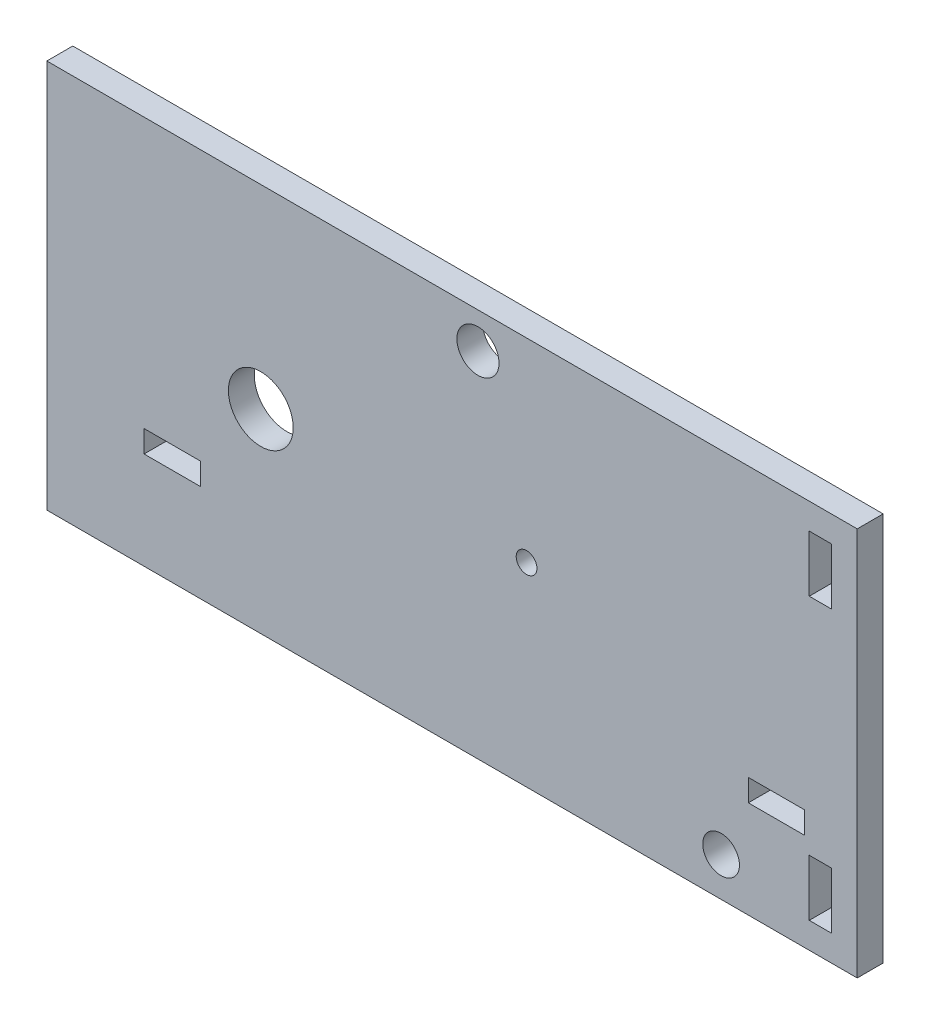
ISO-10303-21;
HEADER;
FILE_DESCRIPTION(('STEP AP214'),'2;1');
FILE_NAME('part.step','',(''),(''),'','','');
FILE_SCHEMA(('AUTOMOTIVE_DESIGN { 1 0 10303 214 1 1 1 1 }'));
ENDSEC;
DATA;
#1=APPLICATION_CONTEXT('core data for automotive mechanical design processes');
#2=APPLICATION_PROTOCOL_DEFINITION('international standard','automotive_design',2000,#1);
#3=PRODUCT_CONTEXT('',#1,'mechanical');
#4=PRODUCT('Part','Part','',(#3));
#5=PRODUCT_RELATED_PRODUCT_CATEGORY('part','',(#4));
#6=PRODUCT_DEFINITION_FORMATION('','',#4);
#7=PRODUCT_DEFINITION_CONTEXT('part definition',#1,'design');
#8=PRODUCT_DEFINITION('design','',#6,#7);
#9=PRODUCT_DEFINITION_SHAPE('','',#8);
#10=(LENGTH_UNIT() NAMED_UNIT(*) SI_UNIT(.MILLI.,.METRE.));
#11=(NAMED_UNIT(*) PLANE_ANGLE_UNIT() SI_UNIT($,.RADIAN.));
#12=(NAMED_UNIT(*) SI_UNIT($,.STERADIAN.) SOLID_ANGLE_UNIT());
#13=UNCERTAINTY_MEASURE_WITH_UNIT(LENGTH_MEASURE(1.E-05),#10,'distance_accuracy_value','');
#14=(GEOMETRIC_REPRESENTATION_CONTEXT(3) GLOBAL_UNCERTAINTY_ASSIGNED_CONTEXT((#13)) GLOBAL_UNIT_ASSIGNED_CONTEXT((#10,
#11,#12)) REPRESENTATION_CONTEXT('',''));
#15=CARTESIAN_POINT('',(0.,0.,0.));
#16=DIRECTION('',(0.,0.,1.));
#17=DIRECTION('',(1.,0.,0.));
#18=AXIS2_PLACEMENT_3D('',#15,#16,#17);
#19=CARTESIAN_POINT('',(0.,0.,4.));
#20=DIRECTION('',(0.,0.,-1.));
#21=DIRECTION('',(-1.,0.,0.));
#22=AXIS2_PLACEMENT_3D('',#19,#20,#21);
#23=PLANE('',#22);
#24=DIRECTION('',(0.,-1.,0.));
#25=VECTOR('',#24,1.);
#26=CARTESIAN_POINT('',(38.6,-17.3,4.));
#27=LINE('',#26,#25);
#28=CARTESIAN_POINT('',(38.6,-17.3,4.));
#29=VERTEX_POINT('',#28);
#30=CARTESIAN_POINT('',(38.6,-26.,4.));
#31=VERTEX_POINT('',#30);
#32=EDGE_CURVE('E210',#29,#31,#27,.T.);
#33=ORIENTED_EDGE('',*,*,#32,.F.);
#34=DIRECTION('',(-1.,0.,0.));
#35=VECTOR('',#34,1.);
#36=CARTESIAN_POINT('',(38.6,-17.3,4.));
#37=LINE('',#36,#35);
#38=CARTESIAN_POINT('',(42.,-17.3,4.));
#39=VERTEX_POINT('',#38);
#40=EDGE_CURVE('E217',#39,#29,#37,.T.);
#41=ORIENTED_EDGE('',*,*,#40,.F.);
#42=DIRECTION('',(0.,1.,0.));
#43=VECTOR('',#42,1.);
#44=CARTESIAN_POINT('',(42.,-17.3,4.));
#45=LINE('',#44,#43);
#46=CARTESIAN_POINT('',(42.,-26.,4.));
#47=VERTEX_POINT('',#46);
#48=EDGE_CURVE('E215',#47,#39,#45,.T.);
#49=ORIENTED_EDGE('',*,*,#48,.F.);
#50=DIRECTION('',(1.,0.,0.));
#51=VECTOR('',#50,1.);
#52=CARTESIAN_POINT('',(38.6,-26.,4.));
#53=LINE('',#52,#51);
#54=EDGE_CURVE('E212',#31,#47,#53,.T.);
#55=ORIENTED_EDGE('',*,*,#54,.F.);
#56=EDGE_LOOP('',(#33,#41,#49,#55));
#57=FACE_BOUND('',#56,.T.);
#58=CARTESIAN_POINT('',(25.,-24.,4.));
#59=DIRECTION('',(0.,0.,1.));
#60=DIRECTION('',(1.,0.,0.));
#61=AXIS2_PLACEMENT_3D('',#58,#59,#60);
#62=CIRCLE('',#61,2.83);
#63=CARTESIAN_POINT('',(27.83,-24.,4.));
#64=VERTEX_POINT('',#63);
#65=EDGE_CURVE('E287',#64,#64,#62,.T.);
#66=ORIENTED_EDGE('',*,*,#65,.F.);
#67=EDGE_LOOP('',(#66));
#68=FACE_BOUND('',#67,.T.);
#69=CARTESIAN_POINT('',(-46.,0.,4.));
#70=DIRECTION('',(0.,0.,1.));
#71=DIRECTION('',(1.,0.,0.));
#72=AXIS2_PLACEMENT_3D('',#69,#70,#71);
#73=CIRCLE('',#72,5.);
#74=CARTESIAN_POINT('',(-41.,0.,4.));
#75=VERTEX_POINT('',#74);
#76=EDGE_CURVE('E293',#75,#75,#73,.T.);
#77=ORIENTED_EDGE('',*,*,#76,.F.);
#78=EDGE_LOOP('',(#77));
#79=FACE_BOUND('',#78,.T.);
#80=CARTESIAN_POINT('',(-12.5,24.5,4.));
#81=DIRECTION('',(0.,0.,1.));
#82=DIRECTION('',(1.,0.,0.));
#83=AXIS2_PLACEMENT_3D('',#80,#81,#82);
#84=CIRCLE('',#83,3.25);
#85=CARTESIAN_POINT('',(-9.25,24.5,4.));
#86=VERTEX_POINT('',#85);
#87=EDGE_CURVE('E299',#86,#86,#84,.T.);
#88=ORIENTED_EDGE('',*,*,#87,.F.);
#89=EDGE_LOOP('',(#88));
#90=FACE_BOUND('',#89,.T.);
#91=DIRECTION('',(0.,-1.,0.));
#92=VECTOR('',#91,1.);
#93=CARTESIAN_POINT('',(-64.,-11.6,4.));
#94=LINE('',#93,#92);
#95=CARTESIAN_POINT('',(-64.,-11.6,4.));
#96=VERTEX_POINT('',#95);
#97=CARTESIAN_POINT('',(-64.,-15.,4.));
#98=VERTEX_POINT('',#97);
#99=EDGE_CURVE('E305',#96,#98,#94,.T.);
#100=ORIENTED_EDGE('',*,*,#99,.F.);
#101=DIRECTION('',(-1.,0.,0.));
#102=VECTOR('',#101,1.);
#103=CARTESIAN_POINT('',(-64.,-11.6,4.));
#104=LINE('',#103,#102);
#105=CARTESIAN_POINT('',(-55.3,-11.6,4.));
#106=VERTEX_POINT('',#105);
#107=EDGE_CURVE('E313',#106,#96,#104,.T.);
#108=ORIENTED_EDGE('',*,*,#107,.F.);
#109=DIRECTION('',(0.,1.,0.));
#110=VECTOR('',#109,1.);
#111=CARTESIAN_POINT('',(-55.3,-11.6,4.));
#112=LINE('',#111,#110);
#113=CARTESIAN_POINT('',(-55.3,-15.,4.));
#114=VERTEX_POINT('',#113);
#115=EDGE_CURVE('E310',#114,#106,#112,.T.);
#116=ORIENTED_EDGE('',*,*,#115,.F.);
#117=DIRECTION('',(1.,0.,0.));
#118=VECTOR('',#117,1.);
#119=CARTESIAN_POINT('',(-64.,-15.,4.));
#120=LINE('',#119,#118);
#121=EDGE_CURVE('E307',#98,#114,#120,.T.);
#122=ORIENTED_EDGE('',*,*,#121,.F.);
#123=EDGE_LOOP('',(#100,#108,#116,#122));
#124=FACE_BOUND('',#123,.T.);
#125=DIRECTION('',(1.,0.,0.));
#126=VECTOR('',#125,1.);
#127=CARTESIAN_POINT('',(-79.,-30.,4.));
#128=LINE('',#127,#126);
#129=CARTESIAN_POINT('',(-79.,-30.,4.));
#130=VERTEX_POINT('',#129);
#131=CARTESIAN_POINT('',(46.,-30.,4.));
#132=VERTEX_POINT('',#131);
#133=EDGE_CURVE('E341',#130,#132,#128,.T.);
#134=ORIENTED_EDGE('',*,*,#133,.T.);
#135=DIRECTION('',(0.,1.,0.));
#136=VECTOR('',#135,1.);
#137=CARTESIAN_POINT('',(46.,30.,4.));
#138=LINE('',#137,#136);
#139=CARTESIAN_POINT('',(46.,30.,4.));
#140=VERTEX_POINT('',#139);
#141=EDGE_CURVE('E238',#132,#140,#138,.T.);
#142=ORIENTED_EDGE('',*,*,#141,.T.);
#143=DIRECTION('',(-1.,0.,0.));
#144=VECTOR('',#143,1.);
#145=CARTESIAN_POINT('',(-79.,30.,4.));
#146=LINE('',#145,#144);
#147=CARTESIAN_POINT('',(-79.,30.,4.));
#148=VERTEX_POINT('',#147);
#149=EDGE_CURVE('E336',#140,#148,#146,.T.);
#150=ORIENTED_EDGE('',*,*,#149,.T.);
#151=DIRECTION('',(0.,-1.,0.));
#152=VECTOR('',#151,1.);
#153=CARTESIAN_POINT('',(-79.,-30.,4.));
#154=LINE('',#153,#152);
#155=EDGE_CURVE('E338',#148,#130,#154,.T.);
#156=ORIENTED_EDGE('',*,*,#155,.T.);
#157=EDGE_LOOP('',(#134,#142,#150,#156));
#158=FACE_BOUND('',#157,.T.);
#159=DIRECTION('',(0.,-1.,0.));
#160=VECTOR('',#159,1.);
#161=CARTESIAN_POINT('',(29.2,-11.6,4.));
#162=LINE('',#161,#160);
#163=CARTESIAN_POINT('',(29.2,-11.6,4.));
#164=VERTEX_POINT('',#163);
#165=CARTESIAN_POINT('',(29.2,-15.,4.));
#166=VERTEX_POINT('',#165);
#167=EDGE_CURVE('E256',#164,#166,#162,.T.);
#168=ORIENTED_EDGE('',*,*,#167,.F.);
#169=DIRECTION('',(-1.,0.,0.));
#170=VECTOR('',#169,1.);
#171=CARTESIAN_POINT('',(29.2,-11.6,4.));
#172=LINE('',#171,#170);
#173=CARTESIAN_POINT('',(37.9,-11.6,4.));
#174=VERTEX_POINT('',#173);
#175=EDGE_CURVE('E264',#174,#164,#172,.T.);
#176=ORIENTED_EDGE('',*,*,#175,.F.);
#177=DIRECTION('',(0.,1.,0.));
#178=VECTOR('',#177,1.);
#179=CARTESIAN_POINT('',(37.9,-11.6,4.));
#180=LINE('',#179,#178);
#181=CARTESIAN_POINT('',(37.9,-15.,4.));
#182=VERTEX_POINT('',#181);
#183=EDGE_CURVE('E261',#182,#174,#180,.T.);
#184=ORIENTED_EDGE('',*,*,#183,.F.);
#185=DIRECTION('',(1.,0.,0.));
#186=VECTOR('',#185,1.);
#187=CARTESIAN_POINT('',(29.2,-15.,4.));
#188=LINE('',#187,#186);
#189=EDGE_CURVE('E258',#166,#182,#188,.T.);
#190=ORIENTED_EDGE('',*,*,#189,.F.);
#191=EDGE_LOOP('',(#168,#176,#184,#190));
#192=FACE_BOUND('',#191,.T.);
#193=CARTESIAN_POINT('',(-5.,0.,4.));
#194=DIRECTION('',(0.,0.,1.));
#195=DIRECTION('',(1.,0.,0.));
#196=AXIS2_PLACEMENT_3D('',#193,#194,#195);
#197=CIRCLE('',#196,1.6);
#198=CARTESIAN_POINT('',(-3.4,0.,4.));
#199=VERTEX_POINT('',#198);
#200=EDGE_CURVE('E250',#199,#199,#197,.T.);
#201=ORIENTED_EDGE('',*,*,#200,.F.);
#202=EDGE_LOOP('',(#201));
#203=FACE_BOUND('',#202,.T.);
#204=DIRECTION('',(0.,-1.,0.));
#205=VECTOR('',#204,1.);
#206=CARTESIAN_POINT('',(38.6,26.,4.));
#207=LINE('',#206,#205);
#208=CARTESIAN_POINT('',(38.6,26.,4.));
#209=VERTEX_POINT('',#208);
#210=CARTESIAN_POINT('',(38.6,17.3,4.));
#211=VERTEX_POINT('',#210);
#212=EDGE_CURVE('E170',#209,#211,#207,.T.);
#213=ORIENTED_EDGE('',*,*,#212,.F.);
#214=DIRECTION('',(-1.,0.,0.));
#215=VECTOR('',#214,1.);
#216=CARTESIAN_POINT('',(38.6,26.,4.));
#217=LINE('',#216,#215);
#218=CARTESIAN_POINT('',(42.,26.,4.));
#219=VERTEX_POINT('',#218);
#220=EDGE_CURVE('E194',#219,#209,#217,.T.);
#221=ORIENTED_EDGE('',*,*,#220,.F.);
#222=DIRECTION('',(0.,1.,0.));
#223=VECTOR('',#222,1.);
#224=CARTESIAN_POINT('',(42.,26.,4.));
#225=LINE('',#224,#223);
#226=CARTESIAN_POINT('',(42.,17.3,4.));
#227=VERTEX_POINT('',#226);
#228=EDGE_CURVE('E192',#227,#219,#225,.T.);
#229=ORIENTED_EDGE('',*,*,#228,.F.);
#230=DIRECTION('',(1.,0.,0.));
#231=VECTOR('',#230,1.);
#232=CARTESIAN_POINT('',(38.6,17.3,4.));
#233=LINE('',#232,#231);
#234=EDGE_CURVE('E180',#211,#227,#233,.T.);
#235=ORIENTED_EDGE('',*,*,#234,.F.);
#236=EDGE_LOOP('',(#213,#221,#229,#235));
#237=FACE_BOUND('',#236,.T.);
#238=ADVANCED_FACE('F32',(#57,#68,#79,#90,#124,#158,#192,#203,#237),#23,.F.);
#239=CARTESIAN_POINT('',(0.,0.,0.));
#240=DIRECTION('',(0.,0.,-1.));
#241=DIRECTION('',(-1.,0.,0.));
#242=AXIS2_PLACEMENT_3D('',#239,#240,#241);
#243=PLANE('',#242);
#244=DIRECTION('',(-1.,0.,0.));
#245=VECTOR('',#244,1.);
#246=CARTESIAN_POINT('',(29.2,-11.6,0.));
#247=LINE('',#246,#245);
#248=CARTESIAN_POINT('',(37.9,-11.6,0.));
#249=VERTEX_POINT('',#248);
#250=CARTESIAN_POINT('',(29.2,-11.6,0.));
#251=VERTEX_POINT('',#250);
#252=EDGE_CURVE('E259',#249,#251,#247,.T.);
#253=ORIENTED_EDGE('',*,*,#252,.T.);
#254=DIRECTION('',(0.,-1.,0.));
#255=VECTOR('',#254,1.);
#256=CARTESIAN_POINT('',(29.2,-11.6,0.));
#257=LINE('',#256,#255);
#258=CARTESIAN_POINT('',(29.2,-15.,0.));
#259=VERTEX_POINT('',#258);
#260=EDGE_CURVE('E253',#251,#259,#257,.T.);
#261=ORIENTED_EDGE('',*,*,#260,.T.);
#262=DIRECTION('',(1.,0.,0.));
#263=VECTOR('',#262,1.);
#264=CARTESIAN_POINT('',(29.2,-15.,0.));
#265=LINE('',#264,#263);
#266=CARTESIAN_POINT('',(37.9,-15.,0.));
#267=VERTEX_POINT('',#266);
#268=EDGE_CURVE('E269',#259,#267,#265,.T.);
#269=ORIENTED_EDGE('',*,*,#268,.T.);
#270=DIRECTION('',(0.,1.,0.));
#271=VECTOR('',#270,1.);
#272=CARTESIAN_POINT('',(37.9,-11.6,0.));
#273=LINE('',#272,#271);
#274=EDGE_CURVE('E272',#267,#249,#273,.T.);
#275=ORIENTED_EDGE('',*,*,#274,.T.);
#276=EDGE_LOOP('',(#253,#261,#269,#275));
#277=FACE_BOUND('',#276,.T.);
#278=CARTESIAN_POINT('',(25.,-24.,0.));
#279=DIRECTION('',(0.,0.,1.));
#280=DIRECTION('',(1.,0.,0.));
#281=AXIS2_PLACEMENT_3D('',#278,#279,#280);
#282=CIRCLE('',#281,2.83);
#283=CARTESIAN_POINT('',(27.83,-24.,0.));
#284=VERTEX_POINT('',#283);
#285=EDGE_CURVE('E286',#284,#284,#282,.T.);
#286=ORIENTED_EDGE('',*,*,#285,.T.);
#287=EDGE_LOOP('',(#286));
#288=FACE_BOUND('',#287,.T.);
#289=CARTESIAN_POINT('',(-12.5,24.5,0.));
#290=DIRECTION('',(0.,0.,1.));
#291=DIRECTION('',(1.,0.,0.));
#292=AXIS2_PLACEMENT_3D('',#289,#290,#291);
#293=CIRCLE('',#292,3.25);
#294=CARTESIAN_POINT('',(-9.25,24.5,0.));
#295=VERTEX_POINT('',#294);
#296=EDGE_CURVE('E296',#295,#295,#293,.T.);
#297=ORIENTED_EDGE('',*,*,#296,.T.);
#298=EDGE_LOOP('',(#297));
#299=FACE_BOUND('',#298,.T.);
#300=DIRECTION('',(-1.,0.,0.));
#301=VECTOR('',#300,1.);
#302=CARTESIAN_POINT('',(-79.,30.,0.));
#303=LINE('',#302,#301);
#304=CARTESIAN_POINT('',(46.,30.,0.));
#305=VERTEX_POINT('',#304);
#306=CARTESIAN_POINT('',(-79.,30.,0.));
#307=VERTEX_POINT('',#306);
#308=EDGE_CURVE('E335',#305,#307,#303,.T.);
#309=ORIENTED_EDGE('',*,*,#308,.F.);
#310=DIRECTION('',(0.,1.,0.));
#311=VECTOR('',#310,1.);
#312=CARTESIAN_POINT('',(46.,30.,0.));
#313=LINE('',#312,#311);
#314=CARTESIAN_POINT('',(46.,-30.,0.));
#315=VERTEX_POINT('',#314);
#316=EDGE_CURVE('E188',#315,#305,#313,.T.);
#317=ORIENTED_EDGE('',*,*,#316,.F.);
#318=DIRECTION('',(1.,0.,0.));
#319=VECTOR('',#318,1.);
#320=CARTESIAN_POINT('',(-79.,-30.,0.));
#321=LINE('',#320,#319);
#322=CARTESIAN_POINT('',(-79.,-30.,0.));
#323=VERTEX_POINT('',#322);
#324=EDGE_CURVE('E339',#323,#315,#321,.T.);
#325=ORIENTED_EDGE('',*,*,#324,.F.);
#326=DIRECTION('',(0.,-1.,0.));
#327=VECTOR('',#326,1.);
#328=CARTESIAN_POINT('',(-79.,-30.,0.));
#329=LINE('',#328,#327);
#330=EDGE_CURVE('E344',#307,#323,#329,.T.);
#331=ORIENTED_EDGE('',*,*,#330,.F.);
#332=EDGE_LOOP('',(#309,#317,#325,#331));
#333=FACE_BOUND('',#332,.T.);
#334=DIRECTION('',(-1.,0.,0.));
#335=VECTOR('',#334,1.);
#336=CARTESIAN_POINT('',(-64.,-11.6,0.));
#337=LINE('',#336,#335);
#338=CARTESIAN_POINT('',(-55.3,-11.6,0.));
#339=VERTEX_POINT('',#338);
#340=CARTESIAN_POINT('',(-64.,-11.6,0.));
#341=VERTEX_POINT('',#340);
#342=EDGE_CURVE('E308',#339,#341,#337,.T.);
#343=ORIENTED_EDGE('',*,*,#342,.T.);
#344=DIRECTION('',(0.,-1.,0.));
#345=VECTOR('',#344,1.);
#346=CARTESIAN_POINT('',(-64.,-11.6,0.));
#347=LINE('',#346,#345);
#348=CARTESIAN_POINT('',(-64.,-15.,0.));
#349=VERTEX_POINT('',#348);
#350=EDGE_CURVE('E302',#341,#349,#347,.T.);
#351=ORIENTED_EDGE('',*,*,#350,.T.);
#352=DIRECTION('',(1.,0.,0.));
#353=VECTOR('',#352,1.);
#354=CARTESIAN_POINT('',(-64.,-15.,0.));
#355=LINE('',#354,#353);
#356=CARTESIAN_POINT('',(-55.3,-15.,0.));
#357=VERTEX_POINT('',#356);
#358=EDGE_CURVE('E318',#349,#357,#355,.T.);
#359=ORIENTED_EDGE('',*,*,#358,.T.);
#360=DIRECTION('',(0.,1.,0.));
#361=VECTOR('',#360,1.);
#362=CARTESIAN_POINT('',(-55.3,-11.6,0.));
#363=LINE('',#362,#361);
#364=EDGE_CURVE('E321',#357,#339,#363,.T.);
#365=ORIENTED_EDGE('',*,*,#364,.T.);
#366=EDGE_LOOP('',(#343,#351,#359,#365));
#367=FACE_BOUND('',#366,.T.);
#368=CARTESIAN_POINT('',(-46.,0.,0.));
#369=DIRECTION('',(0.,0.,1.));
#370=DIRECTION('',(1.,0.,0.));
#371=AXIS2_PLACEMENT_3D('',#368,#369,#370);
#372=CIRCLE('',#371,5.);
#373=CARTESIAN_POINT('',(-41.,0.,0.));
#374=VERTEX_POINT('',#373);
#375=EDGE_CURVE('E290',#374,#374,#372,.T.);
#376=ORIENTED_EDGE('',*,*,#375,.T.);
#377=EDGE_LOOP('',(#376));
#378=FACE_BOUND('',#377,.T.);
#379=CARTESIAN_POINT('',(-5.,0.,0.));
#380=DIRECTION('',(0.,0.,1.));
#381=DIRECTION('',(1.,0.,0.));
#382=AXIS2_PLACEMENT_3D('',#379,#380,#381);
#383=CIRCLE('',#382,1.6);
#384=CARTESIAN_POINT('',(-3.4,0.,0.));
#385=VERTEX_POINT('',#384);
#386=EDGE_CURVE('E249',#385,#385,#383,.T.);
#387=ORIENTED_EDGE('',*,*,#386,.T.);
#388=EDGE_LOOP('',(#387));
#389=FACE_BOUND('',#388,.T.);
#390=DIRECTION('',(-1.,0.,0.));
#391=VECTOR('',#390,1.);
#392=CARTESIAN_POINT('',(38.6,-17.3,0.));
#393=LINE('',#392,#391);
#394=CARTESIAN_POINT('',(42.,-17.3,0.));
#395=VERTEX_POINT('',#394);
#396=CARTESIAN_POINT('',(38.6,-17.3,0.));
#397=VERTEX_POINT('',#396);
#398=EDGE_CURVE('E213',#395,#397,#393,.T.);
#399=ORIENTED_EDGE('',*,*,#398,.T.);
#400=DIRECTION('',(0.,-1.,0.));
#401=VECTOR('',#400,1.);
#402=CARTESIAN_POINT('',(38.6,-17.3,0.));
#403=LINE('',#402,#401);
#404=CARTESIAN_POINT('',(38.6,-26.,0.));
#405=VERTEX_POINT('',#404);
#406=EDGE_CURVE('E220',#397,#405,#403,.T.);
#407=ORIENTED_EDGE('',*,*,#406,.T.);
#408=DIRECTION('',(1.,0.,0.));
#409=VECTOR('',#408,1.);
#410=CARTESIAN_POINT('',(38.6,-26.,0.));
#411=LINE('',#410,#409);
#412=CARTESIAN_POINT('',(42.,-26.,0.));
#413=VERTEX_POINT('',#412);
#414=EDGE_CURVE('E223',#405,#413,#411,.T.);
#415=ORIENTED_EDGE('',*,*,#414,.T.);
#416=DIRECTION('',(0.,1.,0.));
#417=VECTOR('',#416,1.);
#418=CARTESIAN_POINT('',(42.,-17.3,0.));
#419=LINE('',#418,#417);
#420=EDGE_CURVE('E226',#413,#395,#419,.T.);
#421=ORIENTED_EDGE('',*,*,#420,.T.);
#422=EDGE_LOOP('',(#399,#407,#415,#421));
#423=FACE_BOUND('',#422,.T.);
#424=DIRECTION('',(-1.,0.,0.));
#425=VECTOR('',#424,1.);
#426=CARTESIAN_POINT('',(38.6,26.,0.));
#427=LINE('',#426,#425);
#428=CARTESIAN_POINT('',(42.,26.,0.));
#429=VERTEX_POINT('',#428);
#430=CARTESIAN_POINT('',(38.6,26.,0.));
#431=VERTEX_POINT('',#430);
#432=EDGE_CURVE('E181',#429,#431,#427,.T.);
#433=ORIENTED_EDGE('',*,*,#432,.T.);
#434=DIRECTION('',(0.,-1.,0.));
#435=VECTOR('',#434,1.);
#436=CARTESIAN_POINT('',(38.6,26.,0.));
#437=LINE('',#436,#435);
#438=CARTESIAN_POINT('',(38.6,17.3,0.));
#439=VERTEX_POINT('',#438);
#440=EDGE_CURVE('E198',#431,#439,#437,.T.);
#441=ORIENTED_EDGE('',*,*,#440,.T.);
#442=DIRECTION('',(1.,0.,0.));
#443=VECTOR('',#442,1.);
#444=CARTESIAN_POINT('',(38.6,17.3,0.));
#445=LINE('',#444,#443);
#446=CARTESIAN_POINT('',(42.,17.3,0.));
#447=VERTEX_POINT('',#446);
#448=EDGE_CURVE('E187',#439,#447,#445,.T.);
#449=ORIENTED_EDGE('',*,*,#448,.T.);
#450=DIRECTION('',(0.,1.,0.));
#451=VECTOR('',#450,1.);
#452=CARTESIAN_POINT('',(42.,26.,0.));
#453=LINE('',#452,#451);
#454=EDGE_CURVE('E202',#447,#429,#453,.T.);
#455=ORIENTED_EDGE('',*,*,#454,.T.);
#456=EDGE_LOOP('',(#433,#441,#449,#455));
#457=FACE_BOUND('',#456,.T.);
#458=ADVANCED_FACE('F358',(#277,#288,#299,#333,#367,#378,#389,#423,#457),#243,.T.);
#459=CARTESIAN_POINT('',(-79.,30.,4.));
#460=DIRECTION('',(0.,-1.,0.));
#461=DIRECTION('',(0.,0.,-1.));
#462=AXIS2_PLACEMENT_3D('',#459,#460,#461);
#463=PLANE('',#462);
#464=ORIENTED_EDGE('',*,*,#308,.T.);
#465=DIRECTION('',(0.,0.,-1.));
#466=VECTOR('',#465,1.);
#467=CARTESIAN_POINT('',(-79.,30.,4.));
#468=LINE('',#467,#466);
#469=EDGE_CURVE('E11',#148,#307,#468,.T.);
#470=ORIENTED_EDGE('',*,*,#469,.F.);
#471=ORIENTED_EDGE('',*,*,#149,.F.);
#472=DIRECTION('',(0.,0.,-1.));
#473=VECTOR('',#472,1.);
#474=CARTESIAN_POINT('',(46.,30.,4.));
#475=LINE('',#474,#473);
#476=EDGE_CURVE('E241',#140,#305,#475,.T.);
#477=ORIENTED_EDGE('',*,*,#476,.T.);
#478=EDGE_LOOP('',(#464,#470,#471,#477));
#479=FACE_BOUND('',#478,.T.);
#480=ADVANCED_FACE('F34',(#479),#463,.F.);
#481=CARTESIAN_POINT('',(-79.,-30.,4.));
#482=DIRECTION('',(1.,0.,0.));
#483=DIRECTION('',(0.,0.,-1.));
#484=AXIS2_PLACEMENT_3D('',#481,#482,#483);
#485=PLANE('',#484);
#486=ORIENTED_EDGE('',*,*,#330,.T.);
#487=DIRECTION('',(0.,0.,-1.));
#488=VECTOR('',#487,1.);
#489=CARTESIAN_POINT('',(-79.,-30.,4.));
#490=LINE('',#489,#488);
#491=EDGE_CURVE('E40',#130,#323,#490,.T.);
#492=ORIENTED_EDGE('',*,*,#491,.F.);
#493=ORIENTED_EDGE('',*,*,#155,.F.);
#494=ORIENTED_EDGE('',*,*,#469,.T.);
#495=EDGE_LOOP('',(#486,#492,#493,#494));
#496=FACE_BOUND('',#495,.T.);
#497=ADVANCED_FACE('F368',(#496),#485,.F.);
#498=CARTESIAN_POINT('',(-79.,-30.,4.));
#499=DIRECTION('',(0.,1.,0.));
#500=DIRECTION('',(0.,0.,1.));
#501=AXIS2_PLACEMENT_3D('',#498,#499,#500);
#502=PLANE('',#501);
#503=ORIENTED_EDGE('',*,*,#324,.T.);
#504=DIRECTION('',(0.,0.,-1.));
#505=VECTOR('',#504,1.);
#506=CARTESIAN_POINT('',(46.,-30.,4.));
#507=LINE('',#506,#505);
#508=EDGE_CURVE('E246',#132,#315,#507,.T.);
#509=ORIENTED_EDGE('',*,*,#508,.F.);
#510=ORIENTED_EDGE('',*,*,#133,.F.);
#511=ORIENTED_EDGE('',*,*,#491,.T.);
#512=EDGE_LOOP('',(#503,#509,#510,#511));
#513=FACE_BOUND('',#512,.T.);
#514=ADVANCED_FACE('F351',(#513),#502,.F.);
#515=CARTESIAN_POINT('',(-64.,-11.6,4.));
#516=DIRECTION('',(1.,0.,0.));
#517=DIRECTION('',(0.,0.,-1.));
#518=AXIS2_PLACEMENT_3D('',#515,#516,#517);
#519=PLANE('',#518);
#520=ORIENTED_EDGE('',*,*,#350,.F.);
#521=DIRECTION('',(0.,0.,-1.));
#522=VECTOR('',#521,1.);
#523=CARTESIAN_POINT('',(-64.,-11.6,4.));
#524=LINE('',#523,#522);
#525=EDGE_CURVE('E315',#96,#341,#524,.T.);
#526=ORIENTED_EDGE('',*,*,#525,.F.);
#527=ORIENTED_EDGE('',*,*,#99,.T.);
#528=DIRECTION('',(0.,0.,-1.));
#529=VECTOR('',#528,1.);
#530=CARTESIAN_POINT('',(-64.,-15.,4.));
#531=LINE('',#530,#529);
#532=EDGE_CURVE('E332',#98,#349,#531,.T.);
#533=ORIENTED_EDGE('',*,*,#532,.T.);
#534=EDGE_LOOP('',(#520,#526,#527,#533));
#535=FACE_BOUND('',#534,.T.);
#536=ADVANCED_FACE('F374',(#535),#519,.T.);
#537=CARTESIAN_POINT('',(-64.,-15.,4.));
#538=DIRECTION('',(0.,1.,0.));
#539=DIRECTION('',(-1.,0.,0.));
#540=AXIS2_PLACEMENT_3D('',#537,#538,#539);
#541=PLANE('',#540);
#542=ORIENTED_EDGE('',*,*,#358,.F.);
#543=ORIENTED_EDGE('',*,*,#532,.F.);
#544=ORIENTED_EDGE('',*,*,#121,.T.);
#545=DIRECTION('',(0.,0.,-1.));
#546=VECTOR('',#545,1.);
#547=CARTESIAN_POINT('',(-55.3,-15.,4.));
#548=LINE('',#547,#546);
#549=EDGE_CURVE('E330',#114,#357,#548,.T.);
#550=ORIENTED_EDGE('',*,*,#549,.T.);
#551=EDGE_LOOP('',(#542,#543,#544,#550));
#552=FACE_BOUND('',#551,.T.);
#553=ADVANCED_FACE('F389',(#552),#541,.T.);
#554=CARTESIAN_POINT('',(-55.3,-11.6,4.));
#555=DIRECTION('',(-1.,0.,0.));
#556=DIRECTION('',(0.,0.,1.));
#557=AXIS2_PLACEMENT_3D('',#554,#555,#556);
#558=PLANE('',#557);
#559=ORIENTED_EDGE('',*,*,#364,.F.);
#560=ORIENTED_EDGE('',*,*,#549,.F.);
#561=ORIENTED_EDGE('',*,*,#115,.T.);
#562=DIRECTION('',(0.,0.,-1.));
#563=VECTOR('',#562,1.);
#564=CARTESIAN_POINT('',(-55.3,-11.6,4.));
#565=LINE('',#564,#563);
#566=EDGE_CURVE('E328',#106,#339,#565,.T.);
#567=ORIENTED_EDGE('',*,*,#566,.T.);
#568=EDGE_LOOP('',(#559,#560,#561,#567));
#569=FACE_BOUND('',#568,.T.);
#570=ADVANCED_FACE('F393',(#569),#558,.T.);
#571=CARTESIAN_POINT('',(-64.,-11.6,4.));
#572=DIRECTION('',(0.,-1.,0.));
#573=DIRECTION('',(1.,0.,0.));
#574=AXIS2_PLACEMENT_3D('',#571,#572,#573);
#575=PLANE('',#574);
#576=ORIENTED_EDGE('',*,*,#342,.F.);
#577=ORIENTED_EDGE('',*,*,#566,.F.);
#578=ORIENTED_EDGE('',*,*,#107,.T.);
#579=ORIENTED_EDGE('',*,*,#525,.T.);
#580=EDGE_LOOP('',(#576,#577,#578,#579));
#581=FACE_BOUND('',#580,.T.);
#582=ADVANCED_FACE('F397',(#581),#575,.T.);
#583=CARTESIAN_POINT('',(-12.5,24.5,4.));
#584=DIRECTION('',(0.,0.,-1.));
#585=DIRECTION('',(-1.,0.,0.));
#586=AXIS2_PLACEMENT_3D('',#583,#584,#585);
#587=CYLINDRICAL_SURFACE('',#586,3.25);
#588=ORIENTED_EDGE('',*,*,#87,.T.);
#589=EDGE_LOOP('',(#588));
#590=FACE_BOUND('',#589,.T.);
#591=ORIENTED_EDGE('',*,*,#296,.F.);
#592=EDGE_LOOP('',(#591));
#593=FACE_BOUND('',#592,.T.);
#594=ADVANCED_FACE('F401',(#590,#593),#587,.F.);
#595=CARTESIAN_POINT('',(-46.,0.,4.));
#596=DIRECTION('',(0.,0.,-1.));
#597=DIRECTION('',(-1.,0.,0.));
#598=AXIS2_PLACEMENT_3D('',#595,#596,#597);
#599=CYLINDRICAL_SURFACE('',#598,5.);
#600=ORIENTED_EDGE('',*,*,#76,.T.);
#601=EDGE_LOOP('',(#600));
#602=FACE_BOUND('',#601,.T.);
#603=ORIENTED_EDGE('',*,*,#375,.F.);
#604=EDGE_LOOP('',(#603));
#605=FACE_BOUND('',#604,.T.);
#606=ADVANCED_FACE('F405',(#602,#605),#599,.F.);
#607=CARTESIAN_POINT('',(25.,-24.,4.));
#608=DIRECTION('',(0.,0.,-1.));
#609=DIRECTION('',(-1.,0.,0.));
#610=AXIS2_PLACEMENT_3D('',#607,#608,#609);
#611=CYLINDRICAL_SURFACE('',#610,2.83);
#612=ORIENTED_EDGE('',*,*,#65,.T.);
#613=EDGE_LOOP('',(#612));
#614=FACE_BOUND('',#613,.T.);
#615=ORIENTED_EDGE('',*,*,#285,.F.);
#616=EDGE_LOOP('',(#615));
#617=FACE_BOUND('',#616,.T.);
#618=ADVANCED_FACE('F409',(#614,#617),#611,.F.);
#619=CARTESIAN_POINT('',(29.2,-11.6,4.));
#620=DIRECTION('',(1.,0.,0.));
#621=DIRECTION('',(0.,0.,-1.));
#622=AXIS2_PLACEMENT_3D('',#619,#620,#621);
#623=PLANE('',#622);
#624=ORIENTED_EDGE('',*,*,#260,.F.);
#625=DIRECTION('',(0.,0.,-1.));
#626=VECTOR('',#625,1.);
#627=CARTESIAN_POINT('',(29.2,-11.6,4.));
#628=LINE('',#627,#626);
#629=EDGE_CURVE('E266',#164,#251,#628,.T.);
#630=ORIENTED_EDGE('',*,*,#629,.F.);
#631=ORIENTED_EDGE('',*,*,#167,.T.);
#632=DIRECTION('',(0.,0.,-1.));
#633=VECTOR('',#632,1.);
#634=CARTESIAN_POINT('',(29.2,-15.,4.));
#635=LINE('',#634,#633);
#636=EDGE_CURVE('E283',#166,#259,#635,.T.);
#637=ORIENTED_EDGE('',*,*,#636,.T.);
#638=EDGE_LOOP('',(#624,#630,#631,#637));
#639=FACE_BOUND('',#638,.T.);
#640=ADVANCED_FACE('F413',(#639),#623,.T.);
#641=CARTESIAN_POINT('',(29.2,-15.,4.));
#642=DIRECTION('',(0.,1.,0.));
#643=DIRECTION('',(0.,0.,1.));
#644=AXIS2_PLACEMENT_3D('',#641,#642,#643);
#645=PLANE('',#644);
#646=ORIENTED_EDGE('',*,*,#268,.F.);
#647=ORIENTED_EDGE('',*,*,#636,.F.);
#648=ORIENTED_EDGE('',*,*,#189,.T.);
#649=DIRECTION('',(0.,0.,-1.));
#650=VECTOR('',#649,1.);
#651=CARTESIAN_POINT('',(37.9,-15.,4.));
#652=LINE('',#651,#650);
#653=EDGE_CURVE('E281',#182,#267,#652,.T.);
#654=ORIENTED_EDGE('',*,*,#653,.T.);
#655=EDGE_LOOP('',(#646,#647,#648,#654));
#656=FACE_BOUND('',#655,.T.);
#657=ADVANCED_FACE('F417',(#656),#645,.T.);
#658=CARTESIAN_POINT('',(37.9,-11.6,4.));
#659=DIRECTION('',(-1.,0.,0.));
#660=DIRECTION('',(0.,0.,1.));
#661=AXIS2_PLACEMENT_3D('',#658,#659,#660);
#662=PLANE('',#661);
#663=ORIENTED_EDGE('',*,*,#274,.F.);
#664=ORIENTED_EDGE('',*,*,#653,.F.);
#665=ORIENTED_EDGE('',*,*,#183,.T.);
#666=DIRECTION('',(0.,0.,-1.));
#667=VECTOR('',#666,1.);
#668=CARTESIAN_POINT('',(37.9,-11.6,4.));
#669=LINE('',#668,#667);
#670=EDGE_CURVE('E279',#174,#249,#669,.T.);
#671=ORIENTED_EDGE('',*,*,#670,.T.);
#672=EDGE_LOOP('',(#663,#664,#665,#671));
#673=FACE_BOUND('',#672,.T.);
#674=ADVANCED_FACE('F421',(#673),#662,.T.);
#675=CARTESIAN_POINT('',(29.2,-11.6,4.));
#676=DIRECTION('',(0.,-1.,0.));
#677=DIRECTION('',(0.,0.,-1.));
#678=AXIS2_PLACEMENT_3D('',#675,#676,#677);
#679=PLANE('',#678);
#680=ORIENTED_EDGE('',*,*,#252,.F.);
#681=ORIENTED_EDGE('',*,*,#670,.F.);
#682=ORIENTED_EDGE('',*,*,#175,.T.);
#683=ORIENTED_EDGE('',*,*,#629,.T.);
#684=EDGE_LOOP('',(#680,#681,#682,#683));
#685=FACE_BOUND('',#684,.T.);
#686=ADVANCED_FACE('F425',(#685),#679,.T.);
#687=CARTESIAN_POINT('',(-5.,0.,4.));
#688=DIRECTION('',(0.,0.,-1.));
#689=DIRECTION('',(-1.,0.,0.));
#690=AXIS2_PLACEMENT_3D('',#687,#688,#689);
#691=CYLINDRICAL_SURFACE('',#690,1.6);
#692=ORIENTED_EDGE('',*,*,#200,.T.);
#693=EDGE_LOOP('',(#692));
#694=FACE_BOUND('',#693,.T.);
#695=ORIENTED_EDGE('',*,*,#386,.F.);
#696=EDGE_LOOP('',(#695));
#697=FACE_BOUND('',#696,.T.);
#698=ADVANCED_FACE('F429',(#694,#697),#691,.F.);
#699=CARTESIAN_POINT('',(46.,30.,4.));
#700=DIRECTION('',(-1.,0.,0.));
#701=DIRECTION('',(0.,-1.,0.));
#702=AXIS2_PLACEMENT_3D('',#699,#700,#701);
#703=PLANE('',#702);
#704=ORIENTED_EDGE('',*,*,#316,.T.);
#705=ORIENTED_EDGE('',*,*,#476,.F.);
#706=ORIENTED_EDGE('',*,*,#141,.F.);
#707=ORIENTED_EDGE('',*,*,#508,.T.);
#708=EDGE_LOOP('',(#704,#705,#706,#707));
#709=FACE_BOUND('',#708,.T.);
#710=ADVANCED_FACE('F362',(#709),#703,.F.);
#711=CARTESIAN_POINT('',(38.6,-17.3,4.));
#712=DIRECTION('',(1.,0.,0.));
#713=DIRECTION('',(0.,0.,-1.));
#714=AXIS2_PLACEMENT_3D('',#711,#712,#713);
#715=PLANE('',#714);
#716=ORIENTED_EDGE('',*,*,#406,.F.);
#717=DIRECTION('',(0.,0.,-1.));
#718=VECTOR('',#717,1.);
#719=CARTESIAN_POINT('',(38.6,-17.3,4.));
#720=LINE('',#719,#718);
#721=EDGE_CURVE('E219',#29,#397,#720,.T.);
#722=ORIENTED_EDGE('',*,*,#721,.F.);
#723=ORIENTED_EDGE('',*,*,#32,.T.);
#724=DIRECTION('',(0.,0.,-1.));
#725=VECTOR('',#724,1.);
#726=CARTESIAN_POINT('',(38.6,-26.,4.));
#727=LINE('',#726,#725);
#728=EDGE_CURVE('E200',#31,#405,#727,.T.);
#729=ORIENTED_EDGE('',*,*,#728,.T.);
#730=EDGE_LOOP('',(#716,#722,#723,#729));
#731=FACE_BOUND('',#730,.T.);
#732=ADVANCED_FACE('F436',(#731),#715,.T.);
#733=CARTESIAN_POINT('',(38.6,-26.,4.));
#734=DIRECTION('',(0.,1.,0.));
#735=DIRECTION('',(0.,0.,1.));
#736=AXIS2_PLACEMENT_3D('',#733,#734,#735);
#737=PLANE('',#736);
#738=ORIENTED_EDGE('',*,*,#414,.F.);
#739=ORIENTED_EDGE('',*,*,#728,.F.);
#740=ORIENTED_EDGE('',*,*,#54,.T.);
#741=DIRECTION('',(0.,0.,-1.));
#742=VECTOR('',#741,1.);
#743=CARTESIAN_POINT('',(42.,-26.,4.));
#744=LINE('',#743,#742);
#745=EDGE_CURVE('E234',#47,#413,#744,.T.);
#746=ORIENTED_EDGE('',*,*,#745,.T.);
#747=EDGE_LOOP('',(#738,#739,#740,#746));
#748=FACE_BOUND('',#747,.T.);
#749=ADVANCED_FACE('F439',(#748),#737,.T.);
#750=CARTESIAN_POINT('',(42.,-17.3,4.));
#751=DIRECTION('',(-1.,0.,0.));
#752=DIRECTION('',(0.,0.,1.));
#753=AXIS2_PLACEMENT_3D('',#750,#751,#752);
#754=PLANE('',#753);
#755=ORIENTED_EDGE('',*,*,#420,.F.);
#756=ORIENTED_EDGE('',*,*,#745,.F.);
#757=ORIENTED_EDGE('',*,*,#48,.T.);
#758=DIRECTION('',(0.,0.,-1.));
#759=VECTOR('',#758,1.);
#760=CARTESIAN_POINT('',(42.,-17.3,4.));
#761=LINE('',#760,#759);
#762=EDGE_CURVE('E55',#39,#395,#761,.T.);
#763=ORIENTED_EDGE('',*,*,#762,.T.);
#764=EDGE_LOOP('',(#755,#756,#757,#763));
#765=FACE_BOUND('',#764,.T.);
#766=ADVANCED_FACE('F443',(#765),#754,.T.);
#767=CARTESIAN_POINT('',(38.6,-17.3,4.));
#768=DIRECTION('',(0.,-1.,0.));
#769=DIRECTION('',(1.,0.,0.));
#770=AXIS2_PLACEMENT_3D('',#767,#768,#769);
#771=PLANE('',#770);
#772=ORIENTED_EDGE('',*,*,#398,.F.);
#773=ORIENTED_EDGE('',*,*,#762,.F.);
#774=ORIENTED_EDGE('',*,*,#40,.T.);
#775=ORIENTED_EDGE('',*,*,#721,.T.);
#776=EDGE_LOOP('',(#772,#773,#774,#775));
#777=FACE_BOUND('',#776,.T.);
#778=ADVANCED_FACE('F447',(#777),#771,.T.);
#779=CARTESIAN_POINT('',(38.6,26.,4.));
#780=DIRECTION('',(1.,0.,0.));
#781=DIRECTION('',(0.,0.,-1.));
#782=AXIS2_PLACEMENT_3D('',#779,#780,#781);
#783=PLANE('',#782);
#784=ORIENTED_EDGE('',*,*,#440,.F.);
#785=DIRECTION('',(0.,0.,-1.));
#786=VECTOR('',#785,1.);
#787=CARTESIAN_POINT('',(38.6,26.,4.));
#788=LINE('',#787,#786);
#789=EDGE_CURVE('E176',#209,#431,#788,.T.);
#790=ORIENTED_EDGE('',*,*,#789,.F.);
#791=ORIENTED_EDGE('',*,*,#212,.T.);
#792=DIRECTION('',(0.,0.,-1.));
#793=VECTOR('',#792,1.);
#794=CARTESIAN_POINT('',(38.6,17.3,4.));
#795=LINE('',#794,#793);
#796=EDGE_CURVE('E173',#211,#439,#795,.T.);
#797=ORIENTED_EDGE('',*,*,#796,.T.);
#798=EDGE_LOOP('',(#784,#790,#791,#797));
#799=FACE_BOUND('',#798,.T.);
#800=ADVANCED_FACE('F172',(#799),#783,.T.);
#801=CARTESIAN_POINT('',(38.6,17.3,4.));
#802=DIRECTION('',(0.,1.,0.));
#803=DIRECTION('',(-1.,0.,0.));
#804=AXIS2_PLACEMENT_3D('',#801,#802,#803);
#805=PLANE('',#804);
#806=ORIENTED_EDGE('',*,*,#448,.F.);
#807=ORIENTED_EDGE('',*,*,#796,.F.);
#808=ORIENTED_EDGE('',*,*,#234,.T.);
#809=DIRECTION('',(0.,0.,-1.));
#810=VECTOR('',#809,1.);
#811=CARTESIAN_POINT('',(42.,17.3,4.));
#812=LINE('',#811,#810);
#813=EDGE_CURVE('E189',#227,#447,#812,.T.);
#814=ORIENTED_EDGE('',*,*,#813,.T.);
#815=EDGE_LOOP('',(#806,#807,#808,#814));
#816=FACE_BOUND('',#815,.T.);
#817=ADVANCED_FACE('F184',(#816),#805,.T.);
#818=CARTESIAN_POINT('',(42.,26.,4.));
#819=DIRECTION('',(-1.,0.,0.));
#820=DIRECTION('',(0.,0.,1.));
#821=AXIS2_PLACEMENT_3D('',#818,#819,#820);
#822=PLANE('',#821);
#823=ORIENTED_EDGE('',*,*,#454,.F.);
#824=ORIENTED_EDGE('',*,*,#813,.F.);
#825=ORIENTED_EDGE('',*,*,#228,.T.);
#826=DIRECTION('',(0.,0.,-1.));
#827=VECTOR('',#826,1.);
#828=CARTESIAN_POINT('',(42.,26.,4.));
#829=LINE('',#828,#827);
#830=EDGE_CURVE('E47',#219,#429,#829,.T.);
#831=ORIENTED_EDGE('',*,*,#830,.T.);
#832=EDGE_LOOP('',(#823,#824,#825,#831));
#833=FACE_BOUND('',#832,.T.);
#834=ADVANCED_FACE('F455',(#833),#822,.T.);
#835=CARTESIAN_POINT('',(38.6,26.,4.));
#836=DIRECTION('',(0.,-1.,0.));
#837=DIRECTION('',(0.,0.,-1.));
#838=AXIS2_PLACEMENT_3D('',#835,#836,#837);
#839=PLANE('',#838);
#840=ORIENTED_EDGE('',*,*,#432,.F.);
#841=ORIENTED_EDGE('',*,*,#830,.F.);
#842=ORIENTED_EDGE('',*,*,#220,.T.);
#843=ORIENTED_EDGE('',*,*,#789,.T.);
#844=EDGE_LOOP('',(#840,#841,#842,#843));
#845=FACE_BOUND('',#844,.T.);
#846=ADVANCED_FACE('F458',(#845),#839,.T.);
#847=CLOSED_SHELL('',(#238,#458,#480,#497,#514,#536,#553,#570,#582,#594,#606,#618,#640,#657,
#674,#686,#698,#710,#732,#749,#766,#778,#800,#817,#834,#846));
#848=MANIFOLD_SOLID_BREP('B2',#847);
#849=ADVANCED_BREP_SHAPE_REPRESENTATION('',(#18,#848),#14);
#850=SHAPE_DEFINITION_REPRESENTATION(#9,#849);
ENDSEC;
END-ISO-10303-21;
